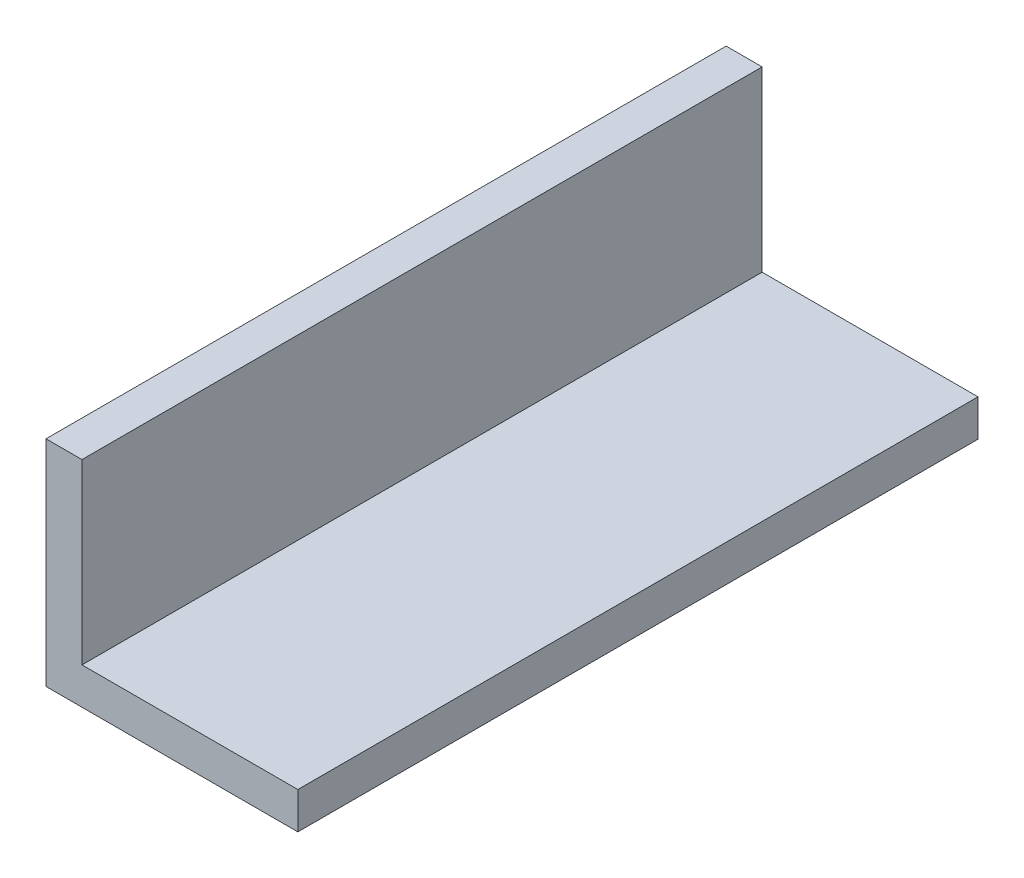
ISO-10303-21;
HEADER;
FILE_DESCRIPTION(('STEP AP214'),'2;1');
FILE_NAME('part.step','',(''),(''),'','','');
FILE_SCHEMA(('AUTOMOTIVE_DESIGN { 1 0 10303 214 1 1 1 1 }'));
ENDSEC;
DATA;
#1=APPLICATION_CONTEXT('core data for automotive mechanical design processes');
#2=APPLICATION_PROTOCOL_DEFINITION('international standard','automotive_design',2000,#1);
#3=PRODUCT_CONTEXT('',#1,'mechanical');
#4=PRODUCT('Part','Part','',(#3));
#5=PRODUCT_RELATED_PRODUCT_CATEGORY('part','',(#4));
#6=PRODUCT_DEFINITION_FORMATION('','',#4);
#7=PRODUCT_DEFINITION_CONTEXT('part definition',#1,'design');
#8=PRODUCT_DEFINITION('design','',#6,#7);
#9=PRODUCT_DEFINITION_SHAPE('','',#8);
#10=(LENGTH_UNIT() NAMED_UNIT(*) SI_UNIT(.MILLI.,.METRE.));
#11=(NAMED_UNIT(*) PLANE_ANGLE_UNIT() SI_UNIT($,.RADIAN.));
#12=(NAMED_UNIT(*) SI_UNIT($,.STERADIAN.) SOLID_ANGLE_UNIT());
#13=UNCERTAINTY_MEASURE_WITH_UNIT(LENGTH_MEASURE(1.E-05),#10,'distance_accuracy_value','');
#14=(GEOMETRIC_REPRESENTATION_CONTEXT(3) GLOBAL_UNCERTAINTY_ASSIGNED_CONTEXT((#13)) GLOBAL_UNIT_ASSIGNED_CONTEXT((#10,
#11,#12)) REPRESENTATION_CONTEXT('',''));
#15=CARTESIAN_POINT('',(0.,0.,0.));
#16=DIRECTION('',(0.,0.,1.));
#17=DIRECTION('',(1.,0.,0.));
#18=AXIS2_PLACEMENT_3D('',#15,#16,#17);
#19=CARTESIAN_POINT('',(0.,60.3872549019608,191.46));
#20=DIRECTION('',(1.,0.,0.));
#21=DIRECTION('',(0.,0.,-1.));
#22=AXIS2_PLACEMENT_3D('',#19,#20,#21);
#23=PLANE('',#22);
#24=DIRECTION('',(0.,-1.,0.));
#25=VECTOR('',#24,1.);
#26=CARTESIAN_POINT('',(0.,60.3872549019608,0.));
#27=LINE('',#26,#25);
#28=CARTESIAN_POINT('',(0.,60.3872549019608,0.));
#29=VERTEX_POINT('',#28);
#30=CARTESIAN_POINT('',(0.,0.,0.));
#31=VERTEX_POINT('',#30);
#32=EDGE_CURVE('E117',#29,#31,#27,.T.);
#33=ORIENTED_EDGE('',*,*,#32,.T.);
#34=DIRECTION('',(0.,0.,-1.));
#35=VECTOR('',#34,1.);
#36=CARTESIAN_POINT('',(0.,0.,191.46));
#37=LINE('',#36,#35);
#38=CARTESIAN_POINT('',(0.,0.,191.46));
#39=VERTEX_POINT('',#38);
#40=EDGE_CURVE('E11',#39,#31,#37,.T.);
#41=ORIENTED_EDGE('',*,*,#40,.F.);
#42=DIRECTION('',(0.,-1.,0.));
#43=VECTOR('',#42,1.);
#44=CARTESIAN_POINT('',(0.,60.3872549019608,191.46));
#45=LINE('',#44,#43);
#46=CARTESIAN_POINT('',(0.,60.3872549019608,191.46));
#47=VERTEX_POINT('',#46);
#48=EDGE_CURVE('E127',#47,#39,#45,.T.);
#49=ORIENTED_EDGE('',*,*,#48,.F.);
#50=DIRECTION('',(0.,0.,-1.));
#51=VECTOR('',#50,1.);
#52=CARTESIAN_POINT('',(0.,60.3872549019608,191.46));
#53=LINE('',#52,#51);
#54=EDGE_CURVE('E113',#47,#29,#53,.T.);
#55=ORIENTED_EDGE('',*,*,#54,.T.);
#56=EDGE_LOOP('',(#33,#41,#49,#55));
#57=FACE_BOUND('',#56,.T.);
#58=ADVANCED_FACE('F33',(#57),#23,.F.);
#59=CARTESIAN_POINT('',(0.,0.,191.46));
#60=DIRECTION('',(0.,1.,0.));
#61=DIRECTION('',(0.,0.,1.));
#62=AXIS2_PLACEMENT_3D('',#59,#60,#61);
#63=PLANE('',#62);
#64=DIRECTION('',(1.,0.,0.));
#65=VECTOR('',#64,1.);
#66=CARTESIAN_POINT('',(0.,0.,0.));
#67=LINE('',#66,#65);
#68=CARTESIAN_POINT('',(70.8940315315315,0.,0.));
#69=VERTEX_POINT('',#68);
#70=EDGE_CURVE('E120',#31,#69,#67,.T.);
#71=ORIENTED_EDGE('',*,*,#70,.T.);
#72=DIRECTION('',(0.,0.,-1.));
#73=VECTOR('',#72,1.);
#74=CARTESIAN_POINT('',(70.8940315315315,0.,191.46));
#75=LINE('',#74,#73);
#76=CARTESIAN_POINT('',(70.8940315315315,0.,191.46));
#77=VERTEX_POINT('',#76);
#78=EDGE_CURVE('E41',#77,#69,#75,.T.);
#79=ORIENTED_EDGE('',*,*,#78,.F.);
#80=DIRECTION('',(1.,0.,0.));
#81=VECTOR('',#80,1.);
#82=CARTESIAN_POINT('',(0.,0.,191.46));
#83=LINE('',#82,#81);
#84=EDGE_CURVE('E86',#39,#77,#83,.T.);
#85=ORIENTED_EDGE('',*,*,#84,.F.);
#86=ORIENTED_EDGE('',*,*,#40,.T.);
#87=EDGE_LOOP('',(#71,#79,#85,#86));
#88=FACE_BOUND('',#87,.T.);
#89=ADVANCED_FACE('F151',(#88),#63,.F.);
#90=CARTESIAN_POINT('',(70.8940315315315,0.,191.46));
#91=DIRECTION('',(-1.,0.,0.));
#92=DIRECTION('',(0.,0.,1.));
#93=AXIS2_PLACEMENT_3D('',#90,#91,#92);
#94=PLANE('',#93);
#95=DIRECTION('',(0.,1.,0.));
#96=VECTOR('',#95,1.);
#97=CARTESIAN_POINT('',(70.8940315315315,0.,0.));
#98=LINE('',#97,#96);
#99=CARTESIAN_POINT('',(70.8940315315315,10.3343137254902,0.));
#100=VERTEX_POINT('',#99);
#101=EDGE_CURVE('E122',#69,#100,#98,.T.);
#102=ORIENTED_EDGE('',*,*,#101,.T.);
#103=DIRECTION('',(0.,0.,-1.));
#104=VECTOR('',#103,1.);
#105=CARTESIAN_POINT('',(70.8940315315315,10.3343137254902,191.46));
#106=LINE('',#105,#104);
#107=CARTESIAN_POINT('',(70.8940315315315,10.3343137254902,191.46));
#108=VERTEX_POINT('',#107);
#109=EDGE_CURVE('E108',#108,#100,#106,.T.);
#110=ORIENTED_EDGE('',*,*,#109,.F.);
#111=DIRECTION('',(0.,1.,0.));
#112=VECTOR('',#111,1.);
#113=CARTESIAN_POINT('',(70.8940315315315,0.,191.46));
#114=LINE('',#113,#112);
#115=EDGE_CURVE('E99',#77,#108,#114,.T.);
#116=ORIENTED_EDGE('',*,*,#115,.F.);
#117=ORIENTED_EDGE('',*,*,#78,.T.);
#118=EDGE_LOOP('',(#102,#110,#116,#117));
#119=FACE_BOUND('',#118,.T.);
#120=ADVANCED_FACE('F133',(#119),#94,.F.);
#121=CARTESIAN_POINT('',(70.8940315315315,10.3343137254902,191.46));
#122=DIRECTION('',(0.,-1.,0.));
#123=DIRECTION('',(0.,0.,-1.));
#124=AXIS2_PLACEMENT_3D('',#121,#122,#123);
#125=PLANE('',#124);
#126=DIRECTION('',(-1.,0.,0.));
#127=VECTOR('',#126,1.);
#128=CARTESIAN_POINT('',(70.8940315315315,10.3343137254902,0.));
#129=LINE('',#128,#127);
#130=CARTESIAN_POINT('',(10.133247217806,10.3343137254902,0.));
#131=VERTEX_POINT('',#130);
#132=EDGE_CURVE('E107',#100,#131,#129,.T.);
#133=ORIENTED_EDGE('',*,*,#132,.T.);
#134=DIRECTION('',(0.,0.,-1.));
#135=VECTOR('',#134,1.);
#136=CARTESIAN_POINT('',(10.133247217806,10.3343137254902,191.46));
#137=LINE('',#136,#135);
#138=CARTESIAN_POINT('',(10.133247217806,10.3343137254902,191.46));
#139=VERTEX_POINT('',#138);
#140=EDGE_CURVE('E104',#139,#131,#137,.T.);
#141=ORIENTED_EDGE('',*,*,#140,.F.);
#142=DIRECTION('',(-1.,0.,0.));
#143=VECTOR('',#142,1.);
#144=CARTESIAN_POINT('',(70.8940315315315,10.3343137254902,191.46));
#145=LINE('',#144,#143);
#146=EDGE_CURVE('E93',#108,#139,#145,.T.);
#147=ORIENTED_EDGE('',*,*,#146,.F.);
#148=ORIENTED_EDGE('',*,*,#109,.T.);
#149=EDGE_LOOP('',(#133,#141,#147,#148));
#150=FACE_BOUND('',#149,.T.);
#151=ADVANCED_FACE('F105',(#150),#125,.F.);
#152=CARTESIAN_POINT('',(10.133247217806,10.3343137254902,191.46));
#153=DIRECTION('',(-1.,0.,0.));
#154=DIRECTION('',(0.,0.,1.));
#155=AXIS2_PLACEMENT_3D('',#152,#153,#154);
#156=PLANE('',#155);
#157=DIRECTION('',(0.,1.,0.));
#158=VECTOR('',#157,1.);
#159=CARTESIAN_POINT('',(10.133247217806,10.3343137254902,0.));
#160=LINE('',#159,#158);
#161=CARTESIAN_POINT('',(10.133247217806,60.3872549019608,0.));
#162=VERTEX_POINT('',#161);
#163=EDGE_CURVE('E72',#131,#162,#160,.T.);
#164=ORIENTED_EDGE('',*,*,#163,.T.);
#165=DIRECTION('',(0.,0.,-1.));
#166=VECTOR('',#165,1.);
#167=CARTESIAN_POINT('',(10.133247217806,60.3872549019608,191.46));
#168=LINE('',#167,#166);
#169=CARTESIAN_POINT('',(10.133247217806,60.3872549019608,191.46));
#170=VERTEX_POINT('',#169);
#171=EDGE_CURVE('E109',#170,#162,#168,.T.);
#172=ORIENTED_EDGE('',*,*,#171,.F.);
#173=DIRECTION('',(0.,1.,0.));
#174=VECTOR('',#173,1.);
#175=CARTESIAN_POINT('',(10.133247217806,10.3343137254902,191.46));
#176=LINE('',#175,#174);
#177=EDGE_CURVE('E97',#139,#170,#176,.T.);
#178=ORIENTED_EDGE('',*,*,#177,.F.);
#179=ORIENTED_EDGE('',*,*,#140,.T.);
#180=EDGE_LOOP('',(#164,#172,#178,#179));
#181=FACE_BOUND('',#180,.T.);
#182=ADVANCED_FACE('F111',(#181),#156,.F.);
#183=CARTESIAN_POINT('',(10.133247217806,60.3872549019608,191.46));
#184=DIRECTION('',(0.,-1.,0.));
#185=DIRECTION('',(0.,0.,-1.));
#186=AXIS2_PLACEMENT_3D('',#183,#184,#185);
#187=PLANE('',#186);
#188=DIRECTION('',(-1.,0.,0.));
#189=VECTOR('',#188,1.);
#190=CARTESIAN_POINT('',(10.133247217806,60.3872549019608,0.));
#191=LINE('',#190,#189);
#192=EDGE_CURVE('E78',#162,#29,#191,.T.);
#193=ORIENTED_EDGE('',*,*,#192,.T.);
#194=ORIENTED_EDGE('',*,*,#54,.F.);
#195=DIRECTION('',(-1.,0.,0.));
#196=VECTOR('',#195,1.);
#197=CARTESIAN_POINT('',(10.133247217806,60.3872549019608,191.46));
#198=LINE('',#197,#196);
#199=EDGE_CURVE('E49',#170,#47,#198,.T.);
#200=ORIENTED_EDGE('',*,*,#199,.F.);
#201=ORIENTED_EDGE('',*,*,#171,.T.);
#202=EDGE_LOOP('',(#193,#194,#200,#201));
#203=FACE_BOUND('',#202,.T.);
#204=ADVANCED_FACE('F140',(#203),#187,.F.);
#205=CARTESIAN_POINT('',(0.,0.,191.46));
#206=DIRECTION('',(0.,0.,1.));
#207=DIRECTION('',(1.,0.,0.));
#208=AXIS2_PLACEMENT_3D('',#205,#206,#207);
#209=PLANE('',#208);
#210=ORIENTED_EDGE('',*,*,#48,.T.);
#211=ORIENTED_EDGE('',*,*,#84,.T.);
#212=ORIENTED_EDGE('',*,*,#115,.T.);
#213=ORIENTED_EDGE('',*,*,#146,.T.);
#214=ORIENTED_EDGE('',*,*,#177,.T.);
#215=ORIENTED_EDGE('',*,*,#199,.T.);
#216=EDGE_LOOP('',(#210,#211,#212,#213,#214,#215));
#217=FACE_BOUND('',#216,.T.);
#218=ADVANCED_FACE('F95',(#217),#209,.T.);
#219=CARTESIAN_POINT('',(0.,0.,0.));
#220=DIRECTION('',(0.,0.,1.));
#221=DIRECTION('',(1.,0.,0.));
#222=AXIS2_PLACEMENT_3D('',#219,#220,#221);
#223=PLANE('',#222);
#224=ORIENTED_EDGE('',*,*,#32,.F.);
#225=ORIENTED_EDGE('',*,*,#192,.F.);
#226=ORIENTED_EDGE('',*,*,#163,.F.);
#227=ORIENTED_EDGE('',*,*,#132,.F.);
#228=ORIENTED_EDGE('',*,*,#101,.F.);
#229=ORIENTED_EDGE('',*,*,#70,.F.);
#230=EDGE_LOOP('',(#224,#225,#226,#227,#228,#229));
#231=FACE_BOUND('',#230,.T.);
#232=ADVANCED_FACE('F136',(#231),#223,.F.);
#233=CLOSED_SHELL('',(#58,#89,#120,#151,#182,#204,#218,#232));
#234=MANIFOLD_SOLID_BREP('B2',#233);
#235=ADVANCED_BREP_SHAPE_REPRESENTATION('',(#18,#234),#14);
#236=SHAPE_DEFINITION_REPRESENTATION(#9,#235);
ENDSEC;
END-ISO-10303-21;
